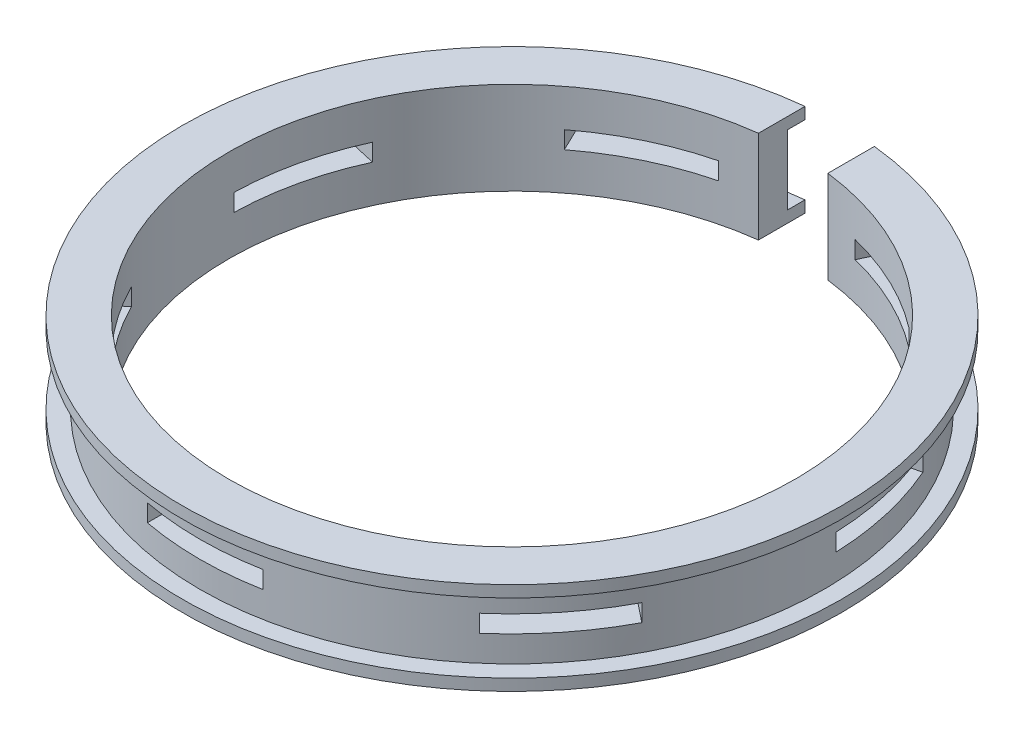
ISO-10303-21;
HEADER;
FILE_DESCRIPTION(('STEP AP214'),'2;1');
FILE_NAME('part.step','',(''),(''),'','','');
FILE_SCHEMA(('AUTOMOTIVE_DESIGN { 1 0 10303 214 1 1 1 1 }'));
ENDSEC;
DATA;
#1=APPLICATION_CONTEXT('core data for automotive mechanical design processes');
#2=APPLICATION_PROTOCOL_DEFINITION('international standard','automotive_design',2000,#1);
#3=PRODUCT_CONTEXT('',#1,'mechanical');
#4=PRODUCT('Part','Part','',(#3));
#5=PRODUCT_RELATED_PRODUCT_CATEGORY('part','',(#4));
#6=PRODUCT_DEFINITION_FORMATION('','',#4);
#7=PRODUCT_DEFINITION_CONTEXT('part definition',#1,'design');
#8=PRODUCT_DEFINITION('design','',#6,#7);
#9=PRODUCT_DEFINITION_SHAPE('','',#8);
#10=(LENGTH_UNIT() NAMED_UNIT(*) SI_UNIT(.MILLI.,.METRE.));
#11=(NAMED_UNIT(*) PLANE_ANGLE_UNIT() SI_UNIT($,.RADIAN.));
#12=(NAMED_UNIT(*) SI_UNIT($,.STERADIAN.) SOLID_ANGLE_UNIT());
#13=UNCERTAINTY_MEASURE_WITH_UNIT(LENGTH_MEASURE(1.E-05),#10,'distance_accuracy_value','');
#14=(GEOMETRIC_REPRESENTATION_CONTEXT(3) GLOBAL_UNCERTAINTY_ASSIGNED_CONTEXT((#13)) GLOBAL_UNIT_ASSIGNED_CONTEXT((#10,
#11,#12)) REPRESENTATION_CONTEXT('',''));
#15=CARTESIAN_POINT('',(0.,0.,0.));
#16=DIRECTION('',(0.,0.,1.));
#17=DIRECTION('',(1.,0.,0.));
#18=AXIS2_PLACEMENT_3D('',#15,#16,#17);
#19=CARTESIAN_POINT('',(0.,0.,0.));
#20=DIRECTION('',(0.,-1.,0.));
#21=DIRECTION('',(0.,0.,-1.));
#22=AXIS2_PLACEMENT_3D('',#19,#20,#21);
#23=CYLINDRICAL_SURFACE('',#22,24.5);
#24=CARTESIAN_POINT('',(0.,3.25,0.));
#25=DIRECTION('',(0.,1.,0.));
#26=DIRECTION('',(0.,0.,1.));
#27=AXIS2_PLACEMENT_3D('',#24,#25,#26);
#28=CIRCLE('',#27,24.5);
#29=CARTESIAN_POINT('',(-22.2704270119836,3.25,-10.2116639537302));
#30=VERTEX_POINT('',#29);
#31=CARTESIAN_POINT('',(-24.4956363515467,3.25,-0.462384831912012));
#32=VERTEX_POINT('',#31);
#33=EDGE_CURVE('E308',#30,#32,#28,.T.);
#34=ORIENTED_EDGE('',*,*,#33,.T.);
#35=DIRECTION('',(0.,-1.,0.));
#36=VECTOR('',#35,1.);
#37=CARTESIAN_POINT('',(-24.4956363515467,0.,-0.462384831912013));
#38=LINE('',#37,#36);
#39=CARTESIAN_POINT('',(-24.4956363515467,4.75000000000001,-0.462384831912012));
#40=VERTEX_POINT('',#39);
#41=EDGE_CURVE('E309',#32,#40,#38,.F.);
#42=ORIENTED_EDGE('',*,*,#41,.T.);
#43=CARTESIAN_POINT('',(0.,4.75000000000001,0.));
#44=DIRECTION('',(0.,-1.,0.));
#45=DIRECTION('',(0.,0.,-1.));
#46=AXIS2_PLACEMENT_3D('',#43,#44,#45);
#47=CIRCLE('',#46,24.5);
#48=CARTESIAN_POINT('',(-22.2704270119836,4.75000000000001,-10.2116639537302));
#49=VERTEX_POINT('',#48);
#50=EDGE_CURVE('E301',#40,#49,#47,.T.);
#51=ORIENTED_EDGE('',*,*,#50,.T.);
#52=DIRECTION('',(0.,-1.,0.));
#53=VECTOR('',#52,1.);
#54=CARTESIAN_POINT('',(-22.2704270119836,0.,-10.2116639537302));
#55=LINE('',#54,#53);
#56=EDGE_CURVE('E318',#49,#30,#55,.T.);
#57=ORIENTED_EDGE('',*,*,#56,.T.);
#58=EDGE_LOOP('',(#34,#42,#51,#57));
#59=FACE_BOUND('',#58,.T.);
#60=CARTESIAN_POINT('',(14.9112724366252,3.25,-19.4397519099587));
#61=VERTEX_POINT('',#60);
#62=CARTESIAN_POINT('',(5.90158375760104,3.25,-23.7785893011343));
#63=VERTEX_POINT('',#62);
#64=EDGE_CURVE('E305',#61,#63,#28,.T.);
#65=ORIENTED_EDGE('',*,*,#64,.T.);
#66=DIRECTION('',(0.,-1.,0.));
#67=VECTOR('',#66,1.);
#68=CARTESIAN_POINT('',(5.90158375760104,0.,-23.7785893011343));
#69=LINE('',#68,#67);
#70=CARTESIAN_POINT('',(5.90158375760104,4.75000000000001,-23.7785893011343));
#71=VERTEX_POINT('',#70);
#72=EDGE_CURVE('E329',#63,#71,#69,.F.);
#73=ORIENTED_EDGE('',*,*,#72,.T.);
#74=CARTESIAN_POINT('',(14.9112724366252,4.75000000000001,-19.4397519099587));
#75=VERTEX_POINT('',#74);
#76=EDGE_CURVE('E303',#71,#75,#47,.T.);
#77=ORIENTED_EDGE('',*,*,#76,.T.);
#78=DIRECTION('',(0.,-1.,0.));
#79=VECTOR('',#78,1.);
#80=CARTESIAN_POINT('',(14.9112724366252,0.,-19.4397519099587));
#81=LINE('',#80,#79);
#82=EDGE_CURVE('E332',#75,#61,#81,.T.);
#83=ORIENTED_EDGE('',*,*,#82,.T.);
#84=EDGE_LOOP('',(#65,#73,#77,#83));
#85=FACE_BOUND('',#84,.T.);
#86=CARTESIAN_POINT('',(21.8691844924211,4.75000000000001,11.0448526308163));
#87=VERTEX_POINT('',#86);
#88=CARTESIAN_POINT('',(15.6342864738337,4.75000000000001,18.8631674554965));
#89=VERTEX_POINT('',#88);
#90=EDGE_CURVE('E465',#87,#89,#47,.T.);
#91=ORIENTED_EDGE('',*,*,#90,.T.);
#92=DIRECTION('',(0.,-1.,0.));
#93=VECTOR('',#92,1.);
#94=CARTESIAN_POINT('',(15.6342864738337,0.,18.8631674554965));
#95=LINE('',#94,#93);
#96=CARTESIAN_POINT('',(15.6342864738337,3.25,18.8631674554965));
#97=VERTEX_POINT('',#96);
#98=EDGE_CURVE('E295',#89,#97,#95,.T.);
#99=ORIENTED_EDGE('',*,*,#98,.T.);
#100=CARTESIAN_POINT('',(21.8691844924211,3.25,11.0448526308163));
#101=VERTEX_POINT('',#100);
#102=EDGE_CURVE('E286',#97,#101,#28,.T.);
#103=ORIENTED_EDGE('',*,*,#102,.T.);
#104=DIRECTION('',(0.,-1.,0.));
#105=VECTOR('',#104,1.);
#106=CARTESIAN_POINT('',(21.8691844924211,0.,11.0448526308163));
#107=LINE('',#106,#105);
#108=EDGE_CURVE('E269',#101,#87,#107,.F.);
#109=ORIENTED_EDGE('',*,*,#108,.T.);
#110=EDGE_LOOP('',(#91,#99,#103,#109));
#111=FACE_BOUND('',#110,.T.);
#112=CARTESIAN_POINT('',(0.,0.,0.));
#113=DIRECTION('',(0.,-1.,0.));
#114=DIRECTION('',(0.,0.,-1.));
#115=AXIS2_PLACEMENT_3D('',#112,#113,#114);
#116=CIRCLE('',#115,24.5);
#117=CARTESIAN_POINT('',(3.,0.,-24.3156328315757));
#118=VERTEX_POINT('',#117);
#119=CARTESIAN_POINT('',(-3.,0.,-24.3156328315757));
#120=VERTEX_POINT('',#119);
#121=EDGE_CURVE('E556',#118,#120,#116,.T.);
#122=ORIENTED_EDGE('',*,*,#121,.T.);
#123=DIRECTION('',(0.,-1.,0.));
#124=VECTOR('',#123,1.);
#125=CARTESIAN_POINT('',(-3.,0.,-24.3156328315757));
#126=LINE('',#125,#124);
#127=CARTESIAN_POINT('',(-3.,8.,-24.3156328315757));
#128=VERTEX_POINT('',#127);
#129=EDGE_CURVE('E532',#120,#128,#126,.F.);
#130=ORIENTED_EDGE('',*,*,#129,.T.);
#131=CARTESIAN_POINT('',(0.,8.,0.));
#132=DIRECTION('',(0.,-1.,0.));
#133=DIRECTION('',(0.,0.,-1.));
#134=AXIS2_PLACEMENT_3D('',#131,#132,#133);
#135=CIRCLE('',#134,24.5);
#136=CARTESIAN_POINT('',(3.,8.,-24.3156328315757));
#137=VERTEX_POINT('',#136);
#138=EDGE_CURVE('E553',#137,#128,#135,.T.);
#139=ORIENTED_EDGE('',*,*,#138,.F.);
#140=DIRECTION('',(0.,-1.,0.));
#141=VECTOR('',#140,1.);
#142=CARTESIAN_POINT('',(3.,0.,-24.3156328315757));
#143=LINE('',#142,#141);
#144=EDGE_CURVE('E517',#137,#118,#143,.T.);
#145=ORIENTED_EDGE('',*,*,#144,.T.);
#146=EDGE_LOOP('',(#122,#130,#139,#145));
#147=FACE_BOUND('',#146,.T.);
#148=CARTESIAN_POINT('',(0.,3.25,0.));
#149=DIRECTION('',(0.,1.,0.));
#150=DIRECTION('',(0.,0.,1.));
#151=AXIS2_PLACEMENT_3D('',#148,#149,#150);
#152=CIRCLE('',#151,24.5);
#153=CARTESIAN_POINT('',(-5.,3.25,23.9843699104229));
#154=VERTEX_POINT('',#153);
#155=CARTESIAN_POINT('',(5.,3.25,23.9843699104229));
#156=VERTEX_POINT('',#155);
#157=EDGE_CURVE('E483',#154,#156,#152,.T.);
#158=ORIENTED_EDGE('',*,*,#157,.T.);
#159=DIRECTION('',(0.,-1.,0.));
#160=VECTOR('',#159,1.);
#161=CARTESIAN_POINT('',(5.,0.,23.9843699104229));
#162=LINE('',#161,#160);
#163=CARTESIAN_POINT('',(5.,4.75000000000001,23.9843699104229));
#164=VERTEX_POINT('',#163);
#165=EDGE_CURVE('E492',#156,#164,#162,.F.);
#166=ORIENTED_EDGE('',*,*,#165,.T.);
#167=CARTESIAN_POINT('',(0.,4.75000000000001,0.));
#168=DIRECTION('',(0.,-1.,0.));
#169=DIRECTION('',(0.,0.,-1.));
#170=AXIS2_PLACEMENT_3D('',#167,#168,#169);
#171=CIRCLE('',#170,24.5);
#172=CARTESIAN_POINT('',(-5.,4.75000000000001,23.9843699104229));
#173=VERTEX_POINT('',#172);
#174=EDGE_CURVE('E489',#164,#173,#171,.T.);
#175=ORIENTED_EDGE('',*,*,#174,.T.);
#176=DIRECTION('',(0.,-1.,0.));
#177=VECTOR('',#176,1.);
#178=CARTESIAN_POINT('',(-5.,0.,23.9843699104229));
#179=LINE('',#178,#177);
#180=EDGE_CURVE('E486',#173,#154,#179,.T.);
#181=ORIENTED_EDGE('',*,*,#180,.T.);
#182=EDGE_LOOP('',(#158,#166,#175,#181));
#183=FACE_BOUND('',#182,.T.);
#184=CARTESIAN_POINT('',(24.4956363515467,3.25,-0.462384831911679));
#185=VERTEX_POINT('',#184);
#186=CARTESIAN_POINT('',(22.2704270119837,3.25,-10.2116639537299));
#187=VERTEX_POINT('',#186);
#188=EDGE_CURVE('E297',#185,#187,#28,.T.);
#189=ORIENTED_EDGE('',*,*,#188,.T.);
#190=DIRECTION('',(0.,-1.,0.));
#191=VECTOR('',#190,1.);
#192=CARTESIAN_POINT('',(22.2704270119837,0.,-10.2116639537299));
#193=LINE('',#192,#191);
#194=CARTESIAN_POINT('',(22.2704270119837,4.75000000000001,-10.2116639537299));
#195=VERTEX_POINT('',#194);
#196=EDGE_CURVE('E335',#187,#195,#193,.F.);
#197=ORIENTED_EDGE('',*,*,#196,.T.);
#198=CARTESIAN_POINT('',(24.4956363515467,4.75000000000001,-0.462384831911678));
#199=VERTEX_POINT('',#198);
#200=EDGE_CURVE('E466',#195,#199,#47,.T.);
#201=ORIENTED_EDGE('',*,*,#200,.T.);
#202=DIRECTION('',(0.,-1.,0.));
#203=VECTOR('',#202,1.);
#204=CARTESIAN_POINT('',(24.4956363515467,0.,-0.462384831911679));
#205=LINE('',#204,#203);
#206=EDGE_CURVE('E280',#199,#185,#205,.T.);
#207=ORIENTED_EDGE('',*,*,#206,.T.);
#208=EDGE_LOOP('',(#189,#197,#201,#207));
#209=FACE_BOUND('',#208,.T.);
#210=CARTESIAN_POINT('',(-5.90158375760071,3.25,-23.7785893011344));
#211=VERTEX_POINT('',#210);
#212=CARTESIAN_POINT('',(-14.9112724366249,3.25,-19.4397519099589));
#213=VERTEX_POINT('',#212);
#214=EDGE_CURVE('E314',#211,#213,#28,.T.);
#215=ORIENTED_EDGE('',*,*,#214,.T.);
#216=DIRECTION('',(0.,-1.,0.));
#217=VECTOR('',#216,1.);
#218=CARTESIAN_POINT('',(-14.9112724366249,0.,-19.4397519099589));
#219=LINE('',#218,#217);
#220=CARTESIAN_POINT('',(-14.9112724366249,4.75000000000001,-19.4397519099589));
#221=VERTEX_POINT('',#220);
#222=EDGE_CURVE('E323',#213,#221,#219,.F.);
#223=ORIENTED_EDGE('',*,*,#222,.T.);
#224=CARTESIAN_POINT('',(-5.90158375760071,4.75000000000001,-23.7785893011344));
#225=VERTEX_POINT('',#224);
#226=EDGE_CURVE('E296',#221,#225,#47,.T.);
#227=ORIENTED_EDGE('',*,*,#226,.T.);
#228=DIRECTION('',(0.,-1.,0.));
#229=VECTOR('',#228,1.);
#230=CARTESIAN_POINT('',(-5.90158375760071,0.,-23.7785893011344));
#231=LINE('',#230,#229);
#232=EDGE_CURVE('E326',#225,#211,#231,.T.);
#233=ORIENTED_EDGE('',*,*,#232,.T.);
#234=EDGE_LOOP('',(#215,#223,#227,#233));
#235=FACE_BOUND('',#234,.T.);
#236=DIRECTION('',(0.,-1.,0.));
#237=VECTOR('',#236,1.);
#238=CARTESIAN_POINT('',(-15.6342864738339,0.,18.8631674554963));
#239=LINE('',#238,#237);
#240=CARTESIAN_POINT('',(-15.6342864738339,3.25,18.8631674554963));
#241=VERTEX_POINT('',#240);
#242=CARTESIAN_POINT('',(-15.6342864738339,4.75000000000001,18.8631674554963));
#243=VERTEX_POINT('',#242);
#244=EDGE_CURVE('E470',#241,#243,#239,.F.);
#245=ORIENTED_EDGE('',*,*,#244,.T.);
#246=CARTESIAN_POINT('',(-21.8691844924212,4.75000000000001,11.044852630816));
#247=VERTEX_POINT('',#246);
#248=EDGE_CURVE('E464',#243,#247,#47,.T.);
#249=ORIENTED_EDGE('',*,*,#248,.T.);
#250=DIRECTION('',(0.,-1.,0.));
#251=VECTOR('',#250,1.);
#252=CARTESIAN_POINT('',(-21.8691844924212,0.,11.044852630816));
#253=LINE('',#252,#251);
#254=CARTESIAN_POINT('',(-21.8691844924212,3.25,11.044852630816));
#255=VERTEX_POINT('',#254);
#256=EDGE_CURVE('E468',#247,#255,#253,.T.);
#257=ORIENTED_EDGE('',*,*,#256,.T.);
#258=EDGE_CURVE('E299',#255,#241,#28,.T.);
#259=ORIENTED_EDGE('',*,*,#258,.T.);
#260=EDGE_LOOP('',(#245,#249,#257,#259));
#261=FACE_BOUND('',#260,.T.);
#262=ADVANCED_FACE('F34',(#59,#85,#111,#147,#183,#209,#235,#261),#23,.F.);
#263=CARTESIAN_POINT('',(0.,0.,0.));
#264=DIRECTION('',(0.,-1.,0.));
#265=DIRECTION('',(0.,0.,-1.));
#266=AXIS2_PLACEMENT_3D('',#263,#264,#265);
#267=CYLINDRICAL_SURFACE('',#266,27.);
#268=CARTESIAN_POINT('',(0.,4.75000000000001,0.));
#269=DIRECTION('',(0.,-1.,0.));
#270=DIRECTION('',(0.,0.,-1.));
#271=AXIS2_PLACEMENT_3D('',#268,#269,#270);
#272=CIRCLE('',#271,27.);
#273=CARTESIAN_POINT('',(-24.7551559890317,4.75000000000001,-10.7787871283696));
#274=VERTEX_POINT('',#273);
#275=CARTESIAN_POINT('',(-26.9803653285949,4.75000000000001,-1.02950800655138));
#276=VERTEX_POINT('',#275);
#277=EDGE_CURVE('E44',#274,#276,#272,.F.);
#278=ORIENTED_EDGE('',*,*,#277,.T.);
#279=DIRECTION('',(0.,-1.,0.));
#280=VECTOR('',#279,1.);
#281=CARTESIAN_POINT('',(-26.9803653285949,0.,-1.02950800655138));
#282=LINE('',#281,#280);
#283=CARTESIAN_POINT('',(-26.9803653285949,3.25,-1.02950800655138));
#284=VERTEX_POINT('',#283);
#285=EDGE_CURVE('E414',#276,#284,#282,.T.);
#286=ORIENTED_EDGE('',*,*,#285,.T.);
#287=CARTESIAN_POINT('',(0.,3.25,0.));
#288=DIRECTION('',(0.,1.,0.));
#289=DIRECTION('',(0.,0.,1.));
#290=AXIS2_PLACEMENT_3D('',#287,#288,#289);
#291=CIRCLE('',#290,27.);
#292=CARTESIAN_POINT('',(-24.7551559890317,3.25,-10.7787871283696));
#293=VERTEX_POINT('',#292);
#294=EDGE_CURVE('E415',#284,#293,#291,.F.);
#295=ORIENTED_EDGE('',*,*,#294,.T.);
#296=DIRECTION('',(0.,-1.,0.));
#297=VECTOR('',#296,1.);
#298=CARTESIAN_POINT('',(-24.7551559890317,0.,-10.7787871283696));
#299=LINE('',#298,#297);
#300=EDGE_CURVE('E445',#293,#274,#299,.F.);
#301=ORIENTED_EDGE('',*,*,#300,.T.);
#302=EDGE_LOOP('',(#278,#286,#295,#301));
#303=FACE_BOUND('',#302,.T.);
#304=CARTESIAN_POINT('',(16.0170808618274,4.75000000000001,-21.7359867654009));
#305=VERTEX_POINT('',#304);
#306=CARTESIAN_POINT('',(7.00739218280321,4.75000000000001,-26.0748241565766));
#307=VERTEX_POINT('',#306);
#308=EDGE_CURVE('E424',#305,#307,#272,.F.);
#309=ORIENTED_EDGE('',*,*,#308,.T.);
#310=DIRECTION('',(0.,-1.,0.));
#311=VECTOR('',#310,1.);
#312=CARTESIAN_POINT('',(7.00739218280321,0.,-26.0748241565766));
#313=LINE('',#312,#311);
#314=CARTESIAN_POINT('',(7.00739218280321,3.25,-26.0748241565766));
#315=VERTEX_POINT('',#314);
#316=EDGE_CURVE('E433',#307,#315,#313,.T.);
#317=ORIENTED_EDGE('',*,*,#316,.T.);
#318=CARTESIAN_POINT('',(16.0170808618274,3.25,-21.7359867654009));
#319=VERTEX_POINT('',#318);
#320=EDGE_CURVE('E418',#315,#319,#291,.F.);
#321=ORIENTED_EDGE('',*,*,#320,.T.);
#322=DIRECTION('',(0.,-1.,0.));
#323=VECTOR('',#322,1.);
#324=CARTESIAN_POINT('',(16.0170808618274,0.,-21.7359867654009));
#325=LINE('',#324,#323);
#326=EDGE_CURVE('E427',#319,#305,#325,.F.);
#327=ORIENTED_EDGE('',*,*,#326,.T.);
#328=EDGE_LOOP('',(#309,#317,#321,#327));
#329=FACE_BOUND('',#328,.T.);
#330=CARTESIAN_POINT('',(23.8617824223638,3.25,12.6338964546878));
#331=VERTEX_POINT('',#330);
#332=CARTESIAN_POINT('',(17.6268844037763,3.25,20.452211279368));
#333=VERTEX_POINT('',#332);
#334=EDGE_CURVE('E289',#331,#333,#291,.F.);
#335=ORIENTED_EDGE('',*,*,#334,.T.);
#336=DIRECTION('',(0.,-1.,0.));
#337=VECTOR('',#336,1.);
#338=CARTESIAN_POINT('',(17.6268844037763,0.,20.452211279368));
#339=LINE('',#338,#337);
#340=CARTESIAN_POINT('',(17.6268844037763,4.75000000000001,20.452211279368));
#341=VERTEX_POINT('',#340);
#342=EDGE_CURVE('E400',#333,#341,#339,.F.);
#343=ORIENTED_EDGE('',*,*,#342,.T.);
#344=CARTESIAN_POINT('',(23.8617824223638,4.75000000000001,12.6338964546878));
#345=VERTEX_POINT('',#344);
#346=EDGE_CURVE('E45',#341,#345,#272,.F.);
#347=ORIENTED_EDGE('',*,*,#346,.T.);
#348=DIRECTION('',(0.,-1.,0.));
#349=VECTOR('',#348,1.);
#350=CARTESIAN_POINT('',(23.8617824223638,0.,12.6338964546878));
#351=LINE('',#350,#349);
#352=EDGE_CURVE('E405',#345,#331,#351,.T.);
#353=ORIENTED_EDGE('',*,*,#352,.T.);
#354=EDGE_LOOP('',(#335,#343,#347,#353));
#355=FACE_BOUND('',#354,.T.);
#356=CARTESIAN_POINT('',(0.,7.,0.));
#357=DIRECTION('',(0.,-1.,0.));
#358=DIRECTION('',(0.,0.,-1.));
#359=AXIS2_PLACEMENT_3D('',#356,#357,#358);
#360=CIRCLE('',#359,27.);
#361=CARTESIAN_POINT('',(3.,7.,-26.8328157299975));
#362=VERTEX_POINT('',#361);
#363=CARTESIAN_POINT('',(-3.,7.,-26.8328157299975));
#364=VERTEX_POINT('',#363);
#365=EDGE_CURVE('E544',#362,#364,#360,.T.);
#366=ORIENTED_EDGE('',*,*,#365,.T.);
#367=DIRECTION('',(0.,-1.,0.));
#368=VECTOR('',#367,1.);
#369=CARTESIAN_POINT('',(-3.,0.,-26.8328157299975));
#370=LINE('',#369,#368);
#371=CARTESIAN_POINT('',(-3.,1.,-26.8328157299975));
#372=VERTEX_POINT('',#371);
#373=EDGE_CURVE('E523',#364,#372,#370,.T.);
#374=ORIENTED_EDGE('',*,*,#373,.T.);
#375=CARTESIAN_POINT('',(0.,1.,0.));
#376=DIRECTION('',(0.,-1.,0.));
#377=DIRECTION('',(0.,0.,-1.));
#378=AXIS2_PLACEMENT_3D('',#375,#376,#377);
#379=CIRCLE('',#378,27.);
#380=CARTESIAN_POINT('',(3.,1.,-26.8328157299975));
#381=VERTEX_POINT('',#380);
#382=EDGE_CURVE('E541',#381,#372,#379,.T.);
#383=ORIENTED_EDGE('',*,*,#382,.F.);
#384=DIRECTION('',(0.,-1.,0.));
#385=VECTOR('',#384,1.);
#386=CARTESIAN_POINT('',(3.,0.,-26.8328157299975));
#387=LINE('',#386,#385);
#388=EDGE_CURVE('E508',#381,#362,#387,.F.);
#389=ORIENTED_EDGE('',*,*,#388,.T.);
#390=EDGE_LOOP('',(#366,#374,#383,#389));
#391=FACE_BOUND('',#390,.T.);
#392=CARTESIAN_POINT('',(0.,4.75000000000001,0.));
#393=DIRECTION('',(0.,-1.,0.));
#394=DIRECTION('',(0.,0.,-1.));
#395=AXIS2_PLACEMENT_3D('',#392,#393,#394);
#396=CIRCLE('',#395,27.);
#397=CARTESIAN_POINT('',(-5.,4.75000000000001,26.5329983228432));
#398=VERTEX_POINT('',#397);
#399=CARTESIAN_POINT('',(5.,4.75000000000001,26.5329983228432));
#400=VERTEX_POINT('',#399);
#401=EDGE_CURVE('E571',#398,#400,#396,.F.);
#402=ORIENTED_EDGE('',*,*,#401,.T.);
#403=DIRECTION('',(0.,-1.,0.));
#404=VECTOR('',#403,1.);
#405=CARTESIAN_POINT('',(5.,0.,26.5329983228432));
#406=LINE('',#405,#404);
#407=CARTESIAN_POINT('',(5.,3.25,26.5329983228432));
#408=VERTEX_POINT('',#407);
#409=EDGE_CURVE('E410',#400,#408,#406,.T.);
#410=ORIENTED_EDGE('',*,*,#409,.T.);
#411=CARTESIAN_POINT('',(0.,3.25,0.));
#412=DIRECTION('',(0.,1.,0.));
#413=DIRECTION('',(0.,0.,1.));
#414=AXIS2_PLACEMENT_3D('',#411,#412,#413);
#415=CIRCLE('',#414,27.);
#416=CARTESIAN_POINT('',(-5.,3.25,26.5329983228432));
#417=VERTEX_POINT('',#416);
#418=EDGE_CURVE('E565',#408,#417,#415,.F.);
#419=ORIENTED_EDGE('',*,*,#418,.T.);
#420=DIRECTION('',(0.,-1.,0.));
#421=VECTOR('',#420,1.);
#422=CARTESIAN_POINT('',(-5.,0.,26.5329983228432));
#423=LINE('',#422,#421);
#424=EDGE_CURVE('E568',#417,#398,#423,.F.);
#425=ORIENTED_EDGE('',*,*,#424,.T.);
#426=EDGE_LOOP('',(#402,#410,#419,#425));
#427=FACE_BOUND('',#426,.T.);
#428=CARTESIAN_POINT('',(26.9803653285949,4.75000000000001,-1.02950800655102));
#429=VERTEX_POINT('',#428);
#430=CARTESIAN_POINT('',(24.7551559890319,4.75000000000001,-10.7787871283693));
#431=VERTEX_POINT('',#430);
#432=EDGE_CURVE('E409',#429,#431,#272,.F.);
#433=ORIENTED_EDGE('',*,*,#432,.T.);
#434=DIRECTION('',(0.,-1.,0.));
#435=VECTOR('',#434,1.);
#436=CARTESIAN_POINT('',(24.7551559890319,0.,-10.7787871283693));
#437=LINE('',#436,#435);
#438=CARTESIAN_POINT('',(24.7551559890319,3.25,-10.7787871283693));
#439=VERTEX_POINT('',#438);
#440=EDGE_CURVE('E423',#431,#439,#437,.T.);
#441=ORIENTED_EDGE('',*,*,#440,.T.);
#442=CARTESIAN_POINT('',(26.9803653285949,3.25,-1.02950800655101));
#443=VERTEX_POINT('',#442);
#444=EDGE_CURVE('E408',#439,#443,#291,.F.);
#445=ORIENTED_EDGE('',*,*,#444,.T.);
#446=DIRECTION('',(0.,-1.,0.));
#447=VECTOR('',#446,1.);
#448=CARTESIAN_POINT('',(26.9803653285949,0.,-1.02950800655102));
#449=LINE('',#448,#447);
#450=EDGE_CURVE('E417',#443,#429,#449,.F.);
#451=ORIENTED_EDGE('',*,*,#450,.T.);
#452=EDGE_LOOP('',(#433,#441,#445,#451));
#453=FACE_BOUND('',#452,.T.);
#454=CARTESIAN_POINT('',(-7.00739218280285,4.75000000000001,-26.0748241565766));
#455=VERTEX_POINT('',#454);
#456=CARTESIAN_POINT('',(-16.0170808618271,4.75000000000001,-21.7359867654011));
#457=VERTEX_POINT('',#456);
#458=EDGE_CURVE('E434',#455,#457,#272,.F.);
#459=ORIENTED_EDGE('',*,*,#458,.T.);
#460=DIRECTION('',(0.,-1.,0.));
#461=VECTOR('',#460,1.);
#462=CARTESIAN_POINT('',(-16.0170808618271,0.,-21.7359867654011));
#463=LINE('',#462,#461);
#464=CARTESIAN_POINT('',(-16.0170808618271,3.25,-21.7359867654011));
#465=VERTEX_POINT('',#464);
#466=EDGE_CURVE('E442',#457,#465,#463,.T.);
#467=ORIENTED_EDGE('',*,*,#466,.T.);
#468=CARTESIAN_POINT('',(-7.00739218280285,3.25,-26.0748241565766));
#469=VERTEX_POINT('',#468);
#470=EDGE_CURVE('E428',#465,#469,#291,.F.);
#471=ORIENTED_EDGE('',*,*,#470,.T.);
#472=DIRECTION('',(0.,-1.,0.));
#473=VECTOR('',#472,1.);
#474=CARTESIAN_POINT('',(-7.00739218280285,0.,-26.0748241565766));
#475=LINE('',#474,#473);
#476=EDGE_CURVE('E437',#469,#455,#475,.F.);
#477=ORIENTED_EDGE('',*,*,#476,.T.);
#478=EDGE_LOOP('',(#459,#467,#471,#477));
#479=FACE_BOUND('',#478,.T.);
#480=DIRECTION('',(0.,-1.,0.));
#481=VECTOR('',#480,1.);
#482=CARTESIAN_POINT('',(-23.8617824223639,0.,12.6338964546874));
#483=LINE('',#482,#481);
#484=CARTESIAN_POINT('',(-23.8617824223639,3.25,12.6338964546874));
#485=VERTEX_POINT('',#484);
#486=CARTESIAN_POINT('',(-23.8617824223639,4.75000000000001,12.6338964546874));
#487=VERTEX_POINT('',#486);
#488=EDGE_CURVE('E413',#485,#487,#483,.F.);
#489=ORIENTED_EDGE('',*,*,#488,.T.);
#490=CARTESIAN_POINT('',(-17.6268844037766,4.75000000000001,20.4522112793677));
#491=VERTEX_POINT('',#490);
#492=EDGE_CURVE('E11',#487,#491,#272,.F.);
#493=ORIENTED_EDGE('',*,*,#492,.T.);
#494=DIRECTION('',(0.,-1.,0.));
#495=VECTOR('',#494,1.);
#496=CARTESIAN_POINT('',(-17.6268844037766,0.,20.4522112793677));
#497=LINE('',#496,#495);
#498=CARTESIAN_POINT('',(-17.6268844037766,3.25,20.4522112793677));
#499=VERTEX_POINT('',#498);
#500=EDGE_CURVE('E38',#491,#499,#497,.T.);
#501=ORIENTED_EDGE('',*,*,#500,.T.);
#502=EDGE_CURVE('E407',#499,#485,#291,.F.);
#503=ORIENTED_EDGE('',*,*,#502,.T.);
#504=EDGE_LOOP('',(#489,#493,#501,#503));
#505=FACE_BOUND('',#504,.T.);
#506=ADVANCED_FACE('F402',(#303,#329,#355,#391,#427,#453,#479,#505),#267,.T.);
#507=CARTESIAN_POINT('',(28.5,0.,0.));
#508=DIRECTION('',(0.,-1.,0.));
#509=DIRECTION('',(0.,0.,-1.));
#510=AXIS2_PLACEMENT_3D('',#507,#508,#509);
#511=PLANE('',#510);
#512=CARTESIAN_POINT('',(0.,0.,0.));
#513=DIRECTION('',(0.,-1.,0.));
#514=DIRECTION('',(0.,0.,-1.));
#515=AXIS2_PLACEMENT_3D('',#512,#513,#514);
#516=CIRCLE('',#515,28.5);
#517=CARTESIAN_POINT('',(3.,0.,-28.3416654415368));
#518=VERTEX_POINT('',#517);
#519=CARTESIAN_POINT('',(-3.,0.,-28.3416654415368));
#520=VERTEX_POINT('',#519);
#521=EDGE_CURVE('E535',#518,#520,#516,.T.);
#522=ORIENTED_EDGE('',*,*,#521,.T.);
#523=DIRECTION('',(0.,0.,1.));
#524=VECTOR('',#523,1.);
#525=CARTESIAN_POINT('',(-3.,0.,-57.));
#526=LINE('',#525,#524);
#527=EDGE_CURVE('E495',#520,#120,#526,.T.);
#528=ORIENTED_EDGE('',*,*,#527,.T.);
#529=ORIENTED_EDGE('',*,*,#121,.F.);
#530=DIRECTION('',(0.,0.,-1.));
#531=VECTOR('',#530,1.);
#532=CARTESIAN_POINT('',(3.,0.,-57.0000000000001));
#533=LINE('',#532,#531);
#534=EDGE_CURVE('E499',#118,#518,#533,.T.);
#535=ORIENTED_EDGE('',*,*,#534,.T.);
#536=EDGE_LOOP('',(#522,#528,#529,#535));
#537=FACE_BOUND('',#536,.T.);
#538=ADVANCED_FACE('F36',(#537),#511,.T.);
#539=CARTESIAN_POINT('',(24.5,8.,0.));
#540=DIRECTION('',(0.,1.,0.));
#541=DIRECTION('',(0.,0.,1.));
#542=AXIS2_PLACEMENT_3D('',#539,#540,#541);
#543=PLANE('',#542);
#544=ORIENTED_EDGE('',*,*,#138,.T.);
#545=DIRECTION('',(0.,0.,1.));
#546=VECTOR('',#545,1.);
#547=CARTESIAN_POINT('',(-3.,8.,-57.));
#548=LINE('',#547,#546);
#549=CARTESIAN_POINT('',(-3.,8.,-28.3416654415368));
#550=VERTEX_POINT('',#549);
#551=EDGE_CURVE('E496',#550,#128,#548,.T.);
#552=ORIENTED_EDGE('',*,*,#551,.F.);
#553=CARTESIAN_POINT('',(0.,8.,0.));
#554=DIRECTION('',(0.,-1.,0.));
#555=DIRECTION('',(0.,0.,-1.));
#556=AXIS2_PLACEMENT_3D('',#553,#554,#555);
#557=CIRCLE('',#556,28.5);
#558=CARTESIAN_POINT('',(3.,8.,-28.3416654415368));
#559=VERTEX_POINT('',#558);
#560=EDGE_CURVE('E550',#559,#550,#557,.T.);
#561=ORIENTED_EDGE('',*,*,#560,.F.);
#562=DIRECTION('',(0.,0.,-1.));
#563=VECTOR('',#562,1.);
#564=CARTESIAN_POINT('',(3.,8.,-57.0000000000001));
#565=LINE('',#564,#563);
#566=EDGE_CURVE('E498',#137,#559,#565,.T.);
#567=ORIENTED_EDGE('',*,*,#566,.F.);
#568=EDGE_LOOP('',(#544,#552,#561,#567));
#569=FACE_BOUND('',#568,.T.);
#570=ADVANCED_FACE('F606',(#569),#543,.T.);
#571=CARTESIAN_POINT('',(0.,0.,0.));
#572=DIRECTION('',(0.,-1.,0.));
#573=DIRECTION('',(0.,0.,-1.));
#574=AXIS2_PLACEMENT_3D('',#571,#572,#573);
#575=CYLINDRICAL_SURFACE('',#574,28.5);
#576=ORIENTED_EDGE('',*,*,#560,.T.);
#577=DIRECTION('',(0.,-1.,0.));
#578=VECTOR('',#577,1.);
#579=CARTESIAN_POINT('',(-3.,0.,-28.3416654415368));
#580=LINE('',#579,#578);
#581=CARTESIAN_POINT('',(-3.,7.,-28.3416654415368));
#582=VERTEX_POINT('',#581);
#583=EDGE_CURVE('E529',#550,#582,#580,.T.);
#584=ORIENTED_EDGE('',*,*,#583,.T.);
#585=CARTESIAN_POINT('',(0.,7.,0.));
#586=DIRECTION('',(0.,-1.,0.));
#587=DIRECTION('',(0.,0.,-1.));
#588=AXIS2_PLACEMENT_3D('',#585,#586,#587);
#589=CIRCLE('',#588,28.5);
#590=CARTESIAN_POINT('',(3.,7.,-28.3416654415368));
#591=VERTEX_POINT('',#590);
#592=EDGE_CURVE('E547',#591,#582,#589,.T.);
#593=ORIENTED_EDGE('',*,*,#592,.F.);
#594=DIRECTION('',(0.,-1.,0.));
#595=VECTOR('',#594,1.);
#596=CARTESIAN_POINT('',(3.,0.,-28.3416654415368));
#597=LINE('',#596,#595);
#598=EDGE_CURVE('E514',#591,#559,#597,.F.);
#599=ORIENTED_EDGE('',*,*,#598,.T.);
#600=EDGE_LOOP('',(#576,#584,#593,#599));
#601=FACE_BOUND('',#600,.T.);
#602=ADVANCED_FACE('F609',(#601),#575,.T.);
#603=CARTESIAN_POINT('',(28.5,7.,0.));
#604=DIRECTION('',(0.,-1.,0.));
#605=DIRECTION('',(0.,0.,-1.));
#606=AXIS2_PLACEMENT_3D('',#603,#604,#605);
#607=PLANE('',#606);
#608=ORIENTED_EDGE('',*,*,#592,.T.);
#609=DIRECTION('',(0.,0.,1.));
#610=VECTOR('',#609,1.);
#611=CARTESIAN_POINT('',(-2.99999999999999,7.,0.));
#612=LINE('',#611,#610);
#613=EDGE_CURVE('E526',#582,#364,#612,.T.);
#614=ORIENTED_EDGE('',*,*,#613,.T.);
#615=ORIENTED_EDGE('',*,*,#365,.F.);
#616=DIRECTION('',(0.,0.,-1.));
#617=VECTOR('',#616,1.);
#618=CARTESIAN_POINT('',(2.99999999999999,7.,0.));
#619=LINE('',#618,#617);
#620=EDGE_CURVE('E511',#362,#591,#619,.T.);
#621=ORIENTED_EDGE('',*,*,#620,.T.);
#622=EDGE_LOOP('',(#608,#614,#615,#621));
#623=FACE_BOUND('',#622,.T.);
#624=ADVANCED_FACE('F613',(#623),#607,.T.);
#625=CARTESIAN_POINT('',(27.,1.,0.));
#626=DIRECTION('',(0.,1.,0.));
#627=DIRECTION('',(0.,0.,1.));
#628=AXIS2_PLACEMENT_3D('',#625,#626,#627);
#629=PLANE('',#628);
#630=ORIENTED_EDGE('',*,*,#382,.T.);
#631=DIRECTION('',(0.,0.,-1.));
#632=VECTOR('',#631,1.);
#633=CARTESIAN_POINT('',(-2.99999999999999,1.,0.));
#634=LINE('',#633,#632);
#635=CARTESIAN_POINT('',(-3.,1.,-28.3416654415368));
#636=VERTEX_POINT('',#635);
#637=EDGE_CURVE('E520',#372,#636,#634,.T.);
#638=ORIENTED_EDGE('',*,*,#637,.T.);
#639=CARTESIAN_POINT('',(0.,1.,0.));
#640=DIRECTION('',(0.,-1.,0.));
#641=DIRECTION('',(0.,0.,-1.));
#642=AXIS2_PLACEMENT_3D('',#639,#640,#641);
#643=CIRCLE('',#642,28.5);
#644=CARTESIAN_POINT('',(3.,1.,-28.3416654415368));
#645=VERTEX_POINT('',#644);
#646=EDGE_CURVE('E538',#645,#636,#643,.T.);
#647=ORIENTED_EDGE('',*,*,#646,.F.);
#648=DIRECTION('',(0.,0.,1.));
#649=VECTOR('',#648,1.);
#650=CARTESIAN_POINT('',(2.99999999999999,1.,0.));
#651=LINE('',#650,#649);
#652=EDGE_CURVE('E501',#645,#381,#651,.T.);
#653=ORIENTED_EDGE('',*,*,#652,.T.);
#654=EDGE_LOOP('',(#630,#638,#647,#653));
#655=FACE_BOUND('',#654,.T.);
#656=ADVANCED_FACE('F616',(#655),#629,.T.);
#657=CARTESIAN_POINT('',(0.,0.,0.));
#658=DIRECTION('',(0.,-1.,0.));
#659=DIRECTION('',(0.,0.,-1.));
#660=AXIS2_PLACEMENT_3D('',#657,#658,#659);
#661=CYLINDRICAL_SURFACE('',#660,28.5);
#662=ORIENTED_EDGE('',*,*,#646,.T.);
#663=DIRECTION('',(0.,-1.,0.));
#664=VECTOR('',#663,1.);
#665=CARTESIAN_POINT('',(-3.,0.,-28.3416654415368));
#666=LINE('',#665,#664);
#667=EDGE_CURVE('E562',#636,#520,#666,.T.);
#668=ORIENTED_EDGE('',*,*,#667,.T.);
#669=ORIENTED_EDGE('',*,*,#521,.F.);
#670=DIRECTION('',(0.,-1.,0.));
#671=VECTOR('',#670,1.);
#672=CARTESIAN_POINT('',(3.,0.,-28.3416654415368));
#673=LINE('',#672,#671);
#674=EDGE_CURVE('E559',#518,#645,#673,.F.);
#675=ORIENTED_EDGE('',*,*,#674,.T.);
#676=EDGE_LOOP('',(#662,#668,#669,#675));
#677=FACE_BOUND('',#676,.T.);
#678=ADVANCED_FACE('F621',(#677),#661,.T.);
#679=CARTESIAN_POINT('',(3.,8.,-57.0000000000001));
#680=DIRECTION('',(-1.,0.,0.));
#681=DIRECTION('',(0.,0.,1.));
#682=AXIS2_PLACEMENT_3D('',#679,#680,#681);
#683=PLANE('',#682);
#684=ORIENTED_EDGE('',*,*,#566,.T.);
#685=ORIENTED_EDGE('',*,*,#598,.F.);
#686=ORIENTED_EDGE('',*,*,#620,.F.);
#687=ORIENTED_EDGE('',*,*,#388,.F.);
#688=ORIENTED_EDGE('',*,*,#652,.F.);
#689=ORIENTED_EDGE('',*,*,#674,.F.);
#690=ORIENTED_EDGE('',*,*,#534,.F.);
#691=ORIENTED_EDGE('',*,*,#144,.F.);
#692=EDGE_LOOP('',(#684,#685,#686,#687,#688,#689,#690,#691));
#693=FACE_BOUND('',#692,.T.);
#694=ADVANCED_FACE('F625',(#693),#683,.T.);
#695=CARTESIAN_POINT('',(-3.,8.,-57.));
#696=DIRECTION('',(1.,0.,0.));
#697=DIRECTION('',(0.,0.,-1.));
#698=AXIS2_PLACEMENT_3D('',#695,#696,#697);
#699=PLANE('',#698);
#700=ORIENTED_EDGE('',*,*,#527,.F.);
#701=ORIENTED_EDGE('',*,*,#667,.F.);
#702=ORIENTED_EDGE('',*,*,#637,.F.);
#703=ORIENTED_EDGE('',*,*,#373,.F.);
#704=ORIENTED_EDGE('',*,*,#613,.F.);
#705=ORIENTED_EDGE('',*,*,#583,.F.);
#706=ORIENTED_EDGE('',*,*,#551,.T.);
#707=ORIENTED_EDGE('',*,*,#129,.F.);
#708=EDGE_LOOP('',(#700,#701,#702,#703,#704,#705,#706,#707));
#709=FACE_BOUND('',#708,.T.);
#710=ADVANCED_FACE('F627',(#709),#699,.T.);
#711=CARTESIAN_POINT('',(5.,3.25,28.5));
#712=DIRECTION('',(-1.,0.,0.));
#713=DIRECTION('',(0.,0.,1.));
#714=AXIS2_PLACEMENT_3D('',#711,#712,#713);
#715=PLANE('',#714);
#716=DIRECTION('',(0.,0.,-1.));
#717=VECTOR('',#716,1.);
#718=CARTESIAN_POINT('',(5.,3.25,28.5));
#719=LINE('',#718,#717);
#720=EDGE_CURVE('E472',#408,#156,#719,.T.);
#721=ORIENTED_EDGE('',*,*,#720,.F.);
#722=ORIENTED_EDGE('',*,*,#409,.F.);
#723=DIRECTION('',(0.,0.,-1.));
#724=VECTOR('',#723,1.);
#725=CARTESIAN_POINT('',(5.,4.75000000000001,28.5));
#726=LINE('',#725,#724);
#727=EDGE_CURVE('E480',#400,#164,#726,.T.);
#728=ORIENTED_EDGE('',*,*,#727,.T.);
#729=ORIENTED_EDGE('',*,*,#165,.F.);
#730=EDGE_LOOP('',(#721,#722,#728,#729));
#731=FACE_BOUND('',#730,.T.);
#732=ADVANCED_FACE('F579',(#731),#715,.T.);
#733=CARTESIAN_POINT('',(-5.,4.75000000000001,28.5));
#734=DIRECTION('',(0.,-1.,0.));
#735=DIRECTION('',(0.,0.,-1.));
#736=AXIS2_PLACEMENT_3D('',#733,#734,#735);
#737=PLANE('',#736);
#738=ORIENTED_EDGE('',*,*,#727,.F.);
#739=ORIENTED_EDGE('',*,*,#401,.F.);
#740=DIRECTION('',(0.,0.,-1.));
#741=VECTOR('',#740,1.);
#742=CARTESIAN_POINT('',(-5.,4.75000000000001,28.5));
#743=LINE('',#742,#741);
#744=EDGE_CURVE('E477',#398,#173,#743,.T.);
#745=ORIENTED_EDGE('',*,*,#744,.T.);
#746=ORIENTED_EDGE('',*,*,#174,.F.);
#747=EDGE_LOOP('',(#738,#739,#745,#746));
#748=FACE_BOUND('',#747,.T.);
#749=ADVANCED_FACE('F582',(#748),#737,.T.);
#750=CARTESIAN_POINT('',(-5.,3.25,28.5));
#751=DIRECTION('',(1.,0.,0.));
#752=DIRECTION('',(0.,0.,-1.));
#753=AXIS2_PLACEMENT_3D('',#750,#751,#752);
#754=PLANE('',#753);
#755=ORIENTED_EDGE('',*,*,#744,.F.);
#756=ORIENTED_EDGE('',*,*,#424,.F.);
#757=DIRECTION('',(0.,0.,-1.));
#758=VECTOR('',#757,1.);
#759=CARTESIAN_POINT('',(-5.,3.25,28.5));
#760=LINE('',#759,#758);
#761=EDGE_CURVE('E474',#417,#154,#760,.T.);
#762=ORIENTED_EDGE('',*,*,#761,.T.);
#763=ORIENTED_EDGE('',*,*,#180,.F.);
#764=EDGE_LOOP('',(#755,#756,#762,#763));
#765=FACE_BOUND('',#764,.T.);
#766=ADVANCED_FACE('F590',(#765),#754,.T.);
#767=CARTESIAN_POINT('',(-5.,3.25,28.5));
#768=DIRECTION('',(0.,1.,0.));
#769=DIRECTION('',(0.,0.,1.));
#770=AXIS2_PLACEMENT_3D('',#767,#768,#769);
#771=PLANE('',#770);
#772=ORIENTED_EDGE('',*,*,#761,.F.);
#773=ORIENTED_EDGE('',*,*,#418,.F.);
#774=ORIENTED_EDGE('',*,*,#720,.T.);
#775=ORIENTED_EDGE('',*,*,#157,.F.);
#776=EDGE_LOOP('',(#772,#773,#774,#775));
#777=FACE_BOUND('',#776,.T.);
#778=ADVANCED_FACE('F587',(#777),#771,.T.);
#779=CARTESIAN_POINT('',(34.4310950667619,3.25,21.0626420273738));
#780=DIRECTION('',(-0.623489801858743,0.,0.781831482468022));
#781=DIRECTION('',(0.781831482468022,0.,0.623489801858743));
#782=AXIS2_PLACEMENT_3D('',#779,#780,#781);
#783=PLANE('',#782);
#784=DIRECTION('',(-0.781831482468022,0.,-0.623489801858743));
#785=VECTOR('',#784,1.);
#786=CARTESIAN_POINT('',(34.4310950667619,3.25,21.0626420273738));
#787=LINE('',#786,#785);
#788=EDGE_CURVE('E272',#331,#101,#787,.T.);
#789=ORIENTED_EDGE('',*,*,#788,.F.);
#790=ORIENTED_EDGE('',*,*,#352,.F.);
#791=DIRECTION('',(-0.781831482468022,0.,-0.623489801858743));
#792=VECTOR('',#791,1.);
#793=CARTESIAN_POINT('',(34.4310950667619,4.75000000000001,21.0626420273738));
#794=LINE('',#793,#792);
#795=EDGE_CURVE('E275',#345,#87,#794,.T.);
#796=ORIENTED_EDGE('',*,*,#795,.T.);
#797=ORIENTED_EDGE('',*,*,#108,.F.);
#798=EDGE_LOOP('',(#789,#790,#796,#797));
#799=FACE_BOUND('',#798,.T.);
#800=ADVANCED_FACE('F271',(#799),#783,.T.);
#801=CARTESIAN_POINT('',(28.1961970481745,3.25,28.880956852054));
#802=DIRECTION('',(0.623489801858743,0.,-0.781831482468022));
#803=DIRECTION('',(-0.781831482468022,0.,-0.623489801858743));
#804=AXIS2_PLACEMENT_3D('',#801,#802,#803);
#805=PLANE('',#804);
#806=DIRECTION('',(-0.781831482468022,0.,-0.623489801858743));
#807=VECTOR('',#806,1.);
#808=CARTESIAN_POINT('',(28.1961970481745,4.75000000000001,28.880956852054));
#809=LINE('',#808,#807);
#810=EDGE_CURVE('E393',#341,#89,#809,.T.);
#811=ORIENTED_EDGE('',*,*,#810,.F.);
#812=ORIENTED_EDGE('',*,*,#342,.F.);
#813=DIRECTION('',(-0.781831482468022,0.,-0.623489801858743));
#814=VECTOR('',#813,1.);
#815=CARTESIAN_POINT('',(28.1961970481745,3.25,28.880956852054));
#816=LINE('',#815,#814);
#817=EDGE_CURVE('E291',#333,#97,#816,.T.);
#818=ORIENTED_EDGE('',*,*,#817,.T.);
#819=ORIENTED_EDGE('',*,*,#98,.F.);
#820=EDGE_LOOP('',(#811,#812,#818,#819));
#821=FACE_BOUND('',#820,.T.);
#822=ADVANCED_FACE('F398',(#821),#805,.T.);
#823=CARTESIAN_POINT('',(-34.4310950667622,3.25,21.0626420273733));
#824=DIRECTION('',(0.,1.,0.));
#825=DIRECTION('',(0.,0.,1.));
#826=AXIS2_PLACEMENT_3D('',#823,#824,#825);
#827=PLANE('',#826);
#828=ORIENTED_EDGE('',*,*,#817,.F.);
#829=ORIENTED_EDGE('',*,*,#334,.F.);
#830=ORIENTED_EDGE('',*,*,#788,.T.);
#831=ORIENTED_EDGE('',*,*,#102,.F.);
#832=EDGE_LOOP('',(#828,#829,#830,#831));
#833=FACE_BOUND('',#832,.T.);
#834=ADVANCED_FACE('F285',(#833),#827,.T.);
#835=CARTESIAN_POINT('',(-34.4310950667622,4.75000000000001,21.0626420273733));
#836=DIRECTION('',(0.,-1.,0.));
#837=DIRECTION('',(0.,0.,-1.));
#838=AXIS2_PLACEMENT_3D('',#835,#836,#837);
#839=PLANE('',#838);
#840=ORIENTED_EDGE('',*,*,#795,.F.);
#841=ORIENTED_EDGE('',*,*,#346,.F.);
#842=ORIENTED_EDGE('',*,*,#810,.T.);
#843=ORIENTED_EDGE('',*,*,#90,.F.);
#844=EDGE_LOOP('',(#840,#841,#842,#843));
#845=FACE_BOUND('',#844,.T.);
#846=ADVANCED_FACE('F689',(#845),#839,.T.);
#847=CARTESIAN_POINT('',(32.1246955851243,3.25,-12.4608364504371));
#848=DIRECTION('',(0.222520933956305,0.,0.974927912181826));
#849=DIRECTION('',(0.974927912181826,0.,-0.222520933956305));
#850=AXIS2_PLACEMENT_3D('',#847,#848,#849);
#851=PLANE('',#850);
#852=DIRECTION('',(-0.974927912181826,0.,0.222520933956305));
#853=VECTOR('',#852,1.);
#854=CARTESIAN_POINT('',(32.1246955851243,3.25,-12.4608364504371));
#855=LINE('',#854,#853);
#856=EDGE_CURVE('E389',#439,#187,#855,.T.);
#857=ORIENTED_EDGE('',*,*,#856,.F.);
#858=ORIENTED_EDGE('',*,*,#440,.F.);
#859=DIRECTION('',(-0.974927912181826,0.,0.222520933956305));
#860=VECTOR('',#859,1.);
#861=CARTESIAN_POINT('',(32.1246955851243,4.75000000000001,-12.4608364504371));
#862=LINE('',#861,#860);
#863=EDGE_CURVE('E381',#431,#195,#862,.T.);
#864=ORIENTED_EDGE('',*,*,#863,.T.);
#865=ORIENTED_EDGE('',*,*,#196,.F.);
#866=EDGE_LOOP('',(#857,#858,#864,#865));
#867=FACE_BOUND('',#866,.T.);
#868=ADVANCED_FACE('F700',(#867),#851,.T.);
#869=CARTESIAN_POINT('',(34.3499049246873,3.25,-2.71155732861884));
#870=DIRECTION('',(-0.222520933956305,0.,-0.974927912181826));
#871=DIRECTION('',(-0.974927912181826,0.,0.222520933956305));
#872=AXIS2_PLACEMENT_3D('',#869,#870,#871);
#873=PLANE('',#872);
#874=DIRECTION('',(-0.974927912181826,0.,0.222520933956305));
#875=VECTOR('',#874,1.);
#876=CARTESIAN_POINT('',(34.3499049246873,4.75000000000001,-2.71155732861884));
#877=LINE('',#876,#875);
#878=EDGE_CURVE('E384',#429,#199,#877,.T.);
#879=ORIENTED_EDGE('',*,*,#878,.F.);
#880=ORIENTED_EDGE('',*,*,#450,.F.);
#881=DIRECTION('',(-0.974927912181826,0.,0.222520933956305));
#882=VECTOR('',#881,1.);
#883=CARTESIAN_POINT('',(34.3499049246873,3.25,-2.71155732861884));
#884=LINE('',#883,#882);
#885=EDGE_CURVE('E387',#443,#185,#884,.T.);
#886=ORIENTED_EDGE('',*,*,#885,.T.);
#887=ORIENTED_EDGE('',*,*,#206,.F.);
#888=EDGE_LOOP('',(#879,#880,#886,#887));
#889=FACE_BOUND('',#888,.T.);
#890=ADVANCED_FACE('F711',(#889),#873,.T.);
#891=ORIENTED_EDGE('',*,*,#885,.F.);
#892=ORIENTED_EDGE('',*,*,#444,.F.);
#893=ORIENTED_EDGE('',*,*,#856,.T.);
#894=ORIENTED_EDGE('',*,*,#188,.F.);
#895=EDGE_LOOP('',(#891,#892,#893,#894));
#896=FACE_BOUND('',#895,.T.);
#897=ADVANCED_FACE('F691',(#896),#827,.T.);
#898=ORIENTED_EDGE('',*,*,#863,.F.);
#899=ORIENTED_EDGE('',*,*,#432,.F.);
#900=ORIENTED_EDGE('',*,*,#878,.T.);
#901=ORIENTED_EDGE('',*,*,#200,.F.);
#902=EDGE_LOOP('',(#898,#899,#900,#901));
#903=FACE_BOUND('',#902,.T.);
#904=ADVANCED_FACE('F703',(#903),#839,.T.);
#905=CARTESIAN_POINT('',(11.9396291378861,3.25,-36.3167197267707));
#906=DIRECTION('',(0.900968867902416,0.,0.433883739117565));
#907=DIRECTION('',(0.433883739117565,0.,-0.900968867902416));
#908=AXIS2_PLACEMENT_3D('',#905,#906,#907);
#909=PLANE('',#908);
#910=DIRECTION('',(-0.433883739117565,0.,0.900968867902416));
#911=VECTOR('',#910,1.);
#912=CARTESIAN_POINT('',(11.9396291378861,3.25,-36.3167197267707));
#913=LINE('',#912,#911);
#914=EDGE_CURVE('E378',#315,#63,#913,.T.);
#915=ORIENTED_EDGE('',*,*,#914,.F.);
#916=ORIENTED_EDGE('',*,*,#316,.F.);
#917=DIRECTION('',(-0.433883739117565,0.,0.900968867902416));
#918=VECTOR('',#917,1.);
#919=CARTESIAN_POINT('',(11.9396291378861,4.75000000000001,-36.3167197267707));
#920=LINE('',#919,#918);
#921=EDGE_CURVE('E370',#307,#71,#920,.T.);
#922=ORIENTED_EDGE('',*,*,#921,.T.);
#923=ORIENTED_EDGE('',*,*,#72,.F.);
#924=EDGE_LOOP('',(#915,#916,#922,#923));
#925=FACE_BOUND('',#924,.T.);
#926=ADVANCED_FACE('F739',(#925),#909,.T.);
#927=CARTESIAN_POINT('',(20.9493178169102,3.25,-31.9778823355951));
#928=DIRECTION('',(-0.900968867902416,0.,-0.433883739117565));
#929=DIRECTION('',(-0.433883739117565,0.,0.900968867902416));
#930=AXIS2_PLACEMENT_3D('',#927,#928,#929);
#931=PLANE('',#930);
#932=DIRECTION('',(-0.433883739117565,0.,0.900968867902416));
#933=VECTOR('',#932,1.);
#934=CARTESIAN_POINT('',(20.9493178169102,4.75000000000001,-31.9778823355951));
#935=LINE('',#934,#933);
#936=EDGE_CURVE('E373',#305,#75,#935,.T.);
#937=ORIENTED_EDGE('',*,*,#936,.F.);
#938=ORIENTED_EDGE('',*,*,#326,.F.);
#939=DIRECTION('',(-0.433883739117565,0.,0.900968867902416));
#940=VECTOR('',#939,1.);
#941=CARTESIAN_POINT('',(20.9493178169102,3.25,-31.9778823355951));
#942=LINE('',#941,#940);
#943=EDGE_CURVE('E376',#319,#61,#942,.T.);
#944=ORIENTED_EDGE('',*,*,#943,.T.);
#945=ORIENTED_EDGE('',*,*,#82,.F.);
#946=EDGE_LOOP('',(#937,#938,#944,#945));
#947=FACE_BOUND('',#946,.T.);
#948=ADVANCED_FACE('F749',(#947),#931,.T.);
#949=ORIENTED_EDGE('',*,*,#943,.F.);
#950=ORIENTED_EDGE('',*,*,#320,.F.);
#951=ORIENTED_EDGE('',*,*,#914,.T.);
#952=ORIENTED_EDGE('',*,*,#64,.F.);
#953=EDGE_LOOP('',(#949,#950,#951,#952));
#954=FACE_BOUND('',#953,.T.);
#955=ADVANCED_FACE('F731',(#954),#827,.T.);
#956=ORIENTED_EDGE('',*,*,#921,.F.);
#957=ORIENTED_EDGE('',*,*,#308,.F.);
#958=ORIENTED_EDGE('',*,*,#936,.T.);
#959=ORIENTED_EDGE('',*,*,#76,.F.);
#960=EDGE_LOOP('',(#956,#957,#958,#959));
#961=FACE_BOUND('',#960,.T.);
#962=ADVANCED_FACE('F741',(#961),#839,.T.);
#963=CARTESIAN_POINT('',(-20.9493178169097,3.25,-31.9778823355952));
#964=DIRECTION('',(0.900968867902422,0.,-0.433883739117553));
#965=DIRECTION('',(-0.433883739117553,0.,-0.900968867902422));
#966=AXIS2_PLACEMENT_3D('',#963,#964,#965);
#967=PLANE('',#966);
#968=DIRECTION('',(0.433883739117553,0.,0.900968867902422));
#969=VECTOR('',#968,1.);
#970=CARTESIAN_POINT('',(-20.9493178169097,3.25,-31.9778823355952));
#971=LINE('',#970,#969);
#972=EDGE_CURVE('E367',#465,#213,#971,.T.);
#973=ORIENTED_EDGE('',*,*,#972,.F.);
#974=ORIENTED_EDGE('',*,*,#466,.F.);
#975=DIRECTION('',(0.433883739117553,0.,0.900968867902422));
#976=VECTOR('',#975,1.);
#977=CARTESIAN_POINT('',(-20.9493178169097,4.75000000000001,-31.9778823355952));
#978=LINE('',#977,#976);
#979=EDGE_CURVE('E359',#457,#221,#978,.T.);
#980=ORIENTED_EDGE('',*,*,#979,.T.);
#981=ORIENTED_EDGE('',*,*,#222,.F.);
#982=EDGE_LOOP('',(#973,#974,#980,#981));
#983=FACE_BOUND('',#982,.T.);
#984=ADVANCED_FACE('F777',(#983),#967,.T.);
#985=CARTESIAN_POINT('',(-11.9396291378855,3.25,-36.3167197267707));
#986=DIRECTION('',(-0.900968867902422,0.,0.433883739117553));
#987=DIRECTION('',(0.433883739117553,0.,0.900968867902422));
#988=AXIS2_PLACEMENT_3D('',#985,#986,#987);
#989=PLANE('',#988);
#990=DIRECTION('',(0.433883739117553,0.,0.900968867902422));
#991=VECTOR('',#990,1.);
#992=CARTESIAN_POINT('',(-11.9396291378855,4.75000000000001,-36.3167197267707));
#993=LINE('',#992,#991);
#994=EDGE_CURVE('E362',#455,#225,#993,.T.);
#995=ORIENTED_EDGE('',*,*,#994,.F.);
#996=ORIENTED_EDGE('',*,*,#476,.F.);
#997=DIRECTION('',(0.433883739117553,0.,0.900968867902422));
#998=VECTOR('',#997,1.);
#999=CARTESIAN_POINT('',(-11.9396291378855,3.25,-36.3167197267707));
#1000=LINE('',#999,#998);
#1001=EDGE_CURVE('E365',#469,#211,#1000,.T.);
#1002=ORIENTED_EDGE('',*,*,#1001,.T.);
#1003=ORIENTED_EDGE('',*,*,#232,.F.);
#1004=EDGE_LOOP('',(#995,#996,#1002,#1003));
#1005=FACE_BOUND('',#1004,.T.);
#1006=ADVANCED_FACE('F787',(#1005),#989,.T.);
#1007=ORIENTED_EDGE('',*,*,#1001,.F.);
#1008=ORIENTED_EDGE('',*,*,#470,.F.);
#1009=ORIENTED_EDGE('',*,*,#972,.T.);
#1010=ORIENTED_EDGE('',*,*,#214,.F.);
#1011=EDGE_LOOP('',(#1007,#1008,#1009,#1010));
#1012=FACE_BOUND('',#1011,.T.);
#1013=ADVANCED_FACE('F769',(#1012),#827,.T.);
#1014=ORIENTED_EDGE('',*,*,#979,.F.);
#1015=ORIENTED_EDGE('',*,*,#458,.F.);
#1016=ORIENTED_EDGE('',*,*,#994,.T.);
#1017=ORIENTED_EDGE('',*,*,#226,.F.);
#1018=EDGE_LOOP('',(#1014,#1015,#1016,#1017));
#1019=FACE_BOUND('',#1018,.T.);
#1020=ADVANCED_FACE('F779',(#1019),#839,.T.);
#1021=CARTESIAN_POINT('',(-34.3499049246875,3.25,-2.71155732861937));
#1022=DIRECTION('',(0.222520933956318,0.,-0.974927912181823));
#1023=DIRECTION('',(-0.974927912181823,0.,-0.222520933956318));
#1024=AXIS2_PLACEMENT_3D('',#1021,#1022,#1023);
#1025=PLANE('',#1024);
#1026=DIRECTION('',(0.974927912181823,0.,0.222520933956318));
#1027=VECTOR('',#1026,1.);
#1028=CARTESIAN_POINT('',(-34.3499049246875,3.25,-2.71155732861937));
#1029=LINE('',#1028,#1027);
#1030=EDGE_CURVE('E356',#284,#32,#1029,.T.);
#1031=ORIENTED_EDGE('',*,*,#1030,.F.);
#1032=ORIENTED_EDGE('',*,*,#285,.F.);
#1033=DIRECTION('',(0.974927912181823,0.,0.222520933956318));
#1034=VECTOR('',#1033,1.);
#1035=CARTESIAN_POINT('',(-34.3499049246875,4.75000000000001,-2.71155732861937));
#1036=LINE('',#1035,#1034);
#1037=EDGE_CURVE('E349',#276,#40,#1036,.T.);
#1038=ORIENTED_EDGE('',*,*,#1037,.T.);
#1039=ORIENTED_EDGE('',*,*,#41,.F.);
#1040=EDGE_LOOP('',(#1031,#1032,#1038,#1039));
#1041=FACE_BOUND('',#1040,.T.);
#1042=ADVANCED_FACE('F815',(#1041),#1025,.T.);
#1043=CARTESIAN_POINT('',(-32.1246955851244,3.25,-12.4608364504376));
#1044=DIRECTION('',(-0.222520933956318,0.,0.974927912181823));
#1045=DIRECTION('',(0.974927912181823,0.,0.222520933956318));
#1046=AXIS2_PLACEMENT_3D('',#1043,#1044,#1045);
#1047=PLANE('',#1046);
#1048=DIRECTION('',(0.974927912181823,0.,0.222520933956318));
#1049=VECTOR('',#1048,1.);
#1050=CARTESIAN_POINT('',(-32.1246955851244,4.75000000000001,-12.4608364504376));
#1051=LINE('',#1050,#1049);
#1052=EDGE_CURVE('E352',#274,#49,#1051,.T.);
#1053=ORIENTED_EDGE('',*,*,#1052,.F.);
#1054=ORIENTED_EDGE('',*,*,#300,.F.);
#1055=DIRECTION('',(0.974927912181823,0.,0.222520933956318));
#1056=VECTOR('',#1055,1.);
#1057=CARTESIAN_POINT('',(-32.1246955851244,3.25,-12.4608364504376));
#1058=LINE('',#1057,#1056);
#1059=EDGE_CURVE('E60',#293,#30,#1058,.T.);
#1060=ORIENTED_EDGE('',*,*,#1059,.T.);
#1061=ORIENTED_EDGE('',*,*,#56,.F.);
#1062=EDGE_LOOP('',(#1053,#1054,#1060,#1061));
#1063=FACE_BOUND('',#1062,.T.);
#1064=ADVANCED_FACE('F825',(#1063),#1047,.T.);
#1065=ORIENTED_EDGE('',*,*,#1059,.F.);
#1066=ORIENTED_EDGE('',*,*,#294,.F.);
#1067=ORIENTED_EDGE('',*,*,#1030,.T.);
#1068=ORIENTED_EDGE('',*,*,#33,.F.);
#1069=EDGE_LOOP('',(#1065,#1066,#1067,#1068));
#1070=FACE_BOUND('',#1069,.T.);
#1071=ADVANCED_FACE('F807',(#1070),#827,.T.);
#1072=ORIENTED_EDGE('',*,*,#1037,.F.);
#1073=ORIENTED_EDGE('',*,*,#277,.F.);
#1074=ORIENTED_EDGE('',*,*,#1052,.T.);
#1075=ORIENTED_EDGE('',*,*,#50,.F.);
#1076=EDGE_LOOP('',(#1072,#1073,#1074,#1075));
#1077=FACE_BOUND('',#1076,.T.);
#1078=ADVANCED_FACE('F817',(#1077),#839,.T.);
#1079=DIRECTION('',(0.781831482468031,0.,-0.623489801858732));
#1080=VECTOR('',#1079,1.);
#1081=CARTESIAN_POINT('',(-28.1961970481748,4.75000000000001,28.8809568520536));
#1082=LINE('',#1081,#1080);
#1083=EDGE_CURVE('E281',#491,#243,#1082,.T.);
#1084=ORIENTED_EDGE('',*,*,#1083,.F.);
#1085=ORIENTED_EDGE('',*,*,#492,.F.);
#1086=DIRECTION('',(0.781831482468031,0.,-0.623489801858732));
#1087=VECTOR('',#1086,1.);
#1088=CARTESIAN_POINT('',(-34.4310950667622,4.75000000000001,21.0626420273733));
#1089=LINE('',#1088,#1087);
#1090=EDGE_CURVE('E342',#487,#247,#1089,.T.);
#1091=ORIENTED_EDGE('',*,*,#1090,.T.);
#1092=ORIENTED_EDGE('',*,*,#248,.F.);
#1093=EDGE_LOOP('',(#1084,#1085,#1091,#1092));
#1094=FACE_BOUND('',#1093,.T.);
#1095=ADVANCED_FACE('F461',(#1094),#839,.T.);
#1096=CARTESIAN_POINT('',(-28.1961970481748,3.25,28.8809568520536));
#1097=DIRECTION('',(-0.623489801858732,0.,-0.781831482468031));
#1098=DIRECTION('',(-0.781831482468031,0.,0.623489801858732));
#1099=AXIS2_PLACEMENT_3D('',#1096,#1097,#1098);
#1100=PLANE('',#1099);
#1101=DIRECTION('',(0.781831482468031,0.,-0.623489801858732));
#1102=VECTOR('',#1101,1.);
#1103=CARTESIAN_POINT('',(-28.1961970481748,3.25,28.8809568520536));
#1104=LINE('',#1103,#1102);
#1105=EDGE_CURVE('E52',#499,#241,#1104,.T.);
#1106=ORIENTED_EDGE('',*,*,#1105,.F.);
#1107=ORIENTED_EDGE('',*,*,#500,.F.);
#1108=ORIENTED_EDGE('',*,*,#1083,.T.);
#1109=ORIENTED_EDGE('',*,*,#244,.F.);
#1110=EDGE_LOOP('',(#1106,#1107,#1108,#1109));
#1111=FACE_BOUND('',#1110,.T.);
#1112=ADVANCED_FACE('F459',(#1111),#1100,.T.);
#1113=CARTESIAN_POINT('',(-34.4310950667622,3.25,21.0626420273733));
#1114=DIRECTION('',(0.623489801858732,0.,0.781831482468031));
#1115=DIRECTION('',(0.781831482468031,0.,-0.623489801858732));
#1116=AXIS2_PLACEMENT_3D('',#1113,#1114,#1115);
#1117=PLANE('',#1116);
#1118=ORIENTED_EDGE('',*,*,#1090,.F.);
#1119=ORIENTED_EDGE('',*,*,#488,.F.);
#1120=DIRECTION('',(0.781831482468031,0.,-0.623489801858732));
#1121=VECTOR('',#1120,1.);
#1122=CARTESIAN_POINT('',(-34.4310950667622,3.25,21.0626420273733));
#1123=LINE('',#1122,#1121);
#1124=EDGE_CURVE('E345',#485,#255,#1123,.T.);
#1125=ORIENTED_EDGE('',*,*,#1124,.T.);
#1126=ORIENTED_EDGE('',*,*,#256,.F.);
#1127=EDGE_LOOP('',(#1118,#1119,#1125,#1126));
#1128=FACE_BOUND('',#1127,.T.);
#1129=ADVANCED_FACE('F866',(#1128),#1117,.T.);
#1130=ORIENTED_EDGE('',*,*,#1124,.F.);
#1131=ORIENTED_EDGE('',*,*,#502,.F.);
#1132=ORIENTED_EDGE('',*,*,#1105,.T.);
#1133=ORIENTED_EDGE('',*,*,#258,.F.);
#1134=EDGE_LOOP('',(#1130,#1131,#1132,#1133));
#1135=FACE_BOUND('',#1134,.T.);
#1136=ADVANCED_FACE('F692',(#1135),#827,.T.);
#1137=CLOSED_SHELL('',(#262,#506,#538,#570,#602,#624,#656,#678,#694,#710,#732,#749,#766,#778,
#800,#822,#834,#846,#868,#890,#897,#904,#926,#948,#955,#962,#984,#1006,#1013,#1020,#1042,#1064,
#1071,#1078,#1095,#1112,#1129,#1136));
#1138=MANIFOLD_SOLID_BREP('B2',#1137);
#1139=ADVANCED_BREP_SHAPE_REPRESENTATION('',(#18,#1138),#14);
#1140=SHAPE_DEFINITION_REPRESENTATION(#9,#1139);
ENDSEC;
END-ISO-10303-21;
